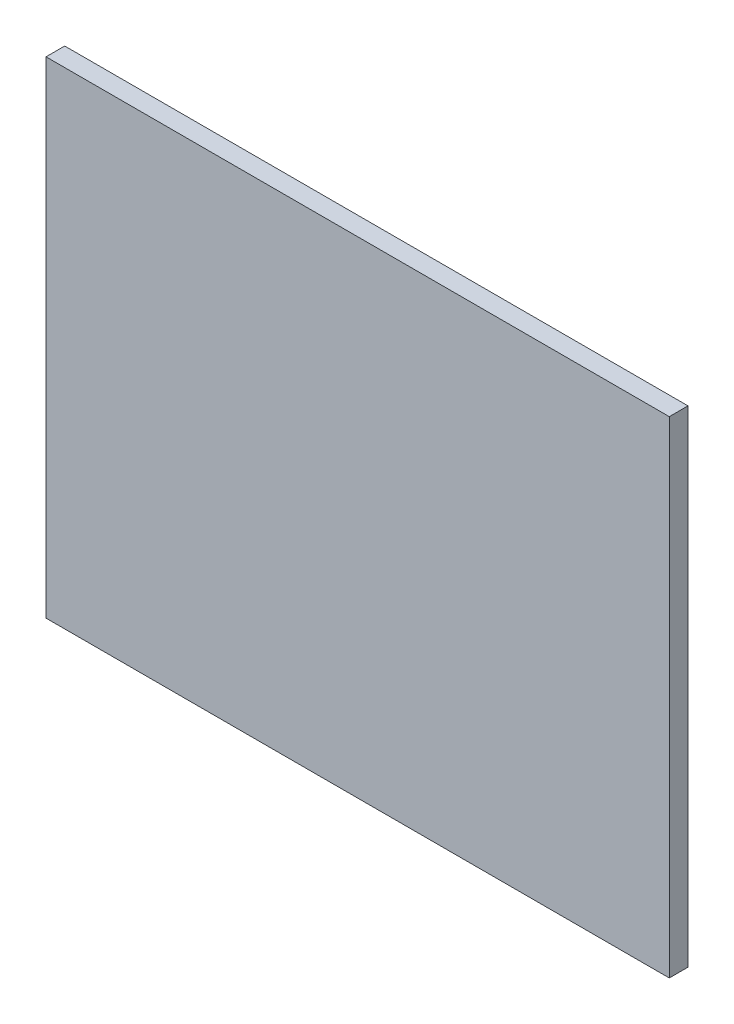
ISO-10303-21;
HEADER;
FILE_DESCRIPTION(('STEP AP214'),'2;1');
FILE_NAME('part.step','',(''),(''),'','','');
FILE_SCHEMA(('AUTOMOTIVE_DESIGN { 1 0 10303 214 1 1 1 1 }'));
ENDSEC;
DATA;
#1=APPLICATION_CONTEXT('core data for automotive mechanical design processes');
#2=APPLICATION_PROTOCOL_DEFINITION('international standard','automotive_design',2000,#1);
#3=PRODUCT_CONTEXT('',#1,'mechanical');
#4=PRODUCT('Part','Part','',(#3));
#5=PRODUCT_RELATED_PRODUCT_CATEGORY('part','',(#4));
#6=PRODUCT_DEFINITION_FORMATION('','',#4);
#7=PRODUCT_DEFINITION_CONTEXT('part definition',#1,'design');
#8=PRODUCT_DEFINITION('design','',#6,#7);
#9=PRODUCT_DEFINITION_SHAPE('','',#8);
#10=(LENGTH_UNIT() NAMED_UNIT(*) SI_UNIT(.MILLI.,.METRE.));
#11=(NAMED_UNIT(*) PLANE_ANGLE_UNIT() SI_UNIT($,.RADIAN.));
#12=(NAMED_UNIT(*) SI_UNIT($,.STERADIAN.) SOLID_ANGLE_UNIT());
#13=UNCERTAINTY_MEASURE_WITH_UNIT(LENGTH_MEASURE(1.E-05),#10,'distance_accuracy_value','');
#14=(GEOMETRIC_REPRESENTATION_CONTEXT(3) GLOBAL_UNCERTAINTY_ASSIGNED_CONTEXT((#13)) GLOBAL_UNIT_ASSIGNED_CONTEXT((#10,
#11,#12)) REPRESENTATION_CONTEXT('',''));
#15=CARTESIAN_POINT('',(0.,0.,0.));
#16=DIRECTION('',(0.,0.,1.));
#17=DIRECTION('',(1.,0.,0.));
#18=AXIS2_PLACEMENT_3D('',#15,#16,#17);
#19=CARTESIAN_POINT('',(250.,195.,15.));
#20=DIRECTION('',(-1.,0.,0.));
#21=DIRECTION('',(0.,-1.,0.));
#22=AXIS2_PLACEMENT_3D('',#19,#20,#21);
#23=PLANE('',#22);
#24=DIRECTION('',(0.,1.,0.));
#25=VECTOR('',#24,1.);
#26=CARTESIAN_POINT('',(250.,195.,0.));
#27=LINE('',#26,#25);
#28=CARTESIAN_POINT('',(250.,-195.,0.));
#29=VERTEX_POINT('',#28);
#30=CARTESIAN_POINT('',(250.,195.,0.));
#31=VERTEX_POINT('',#30);
#32=EDGE_CURVE('E107',#29,#31,#27,.T.);
#33=ORIENTED_EDGE('',*,*,#32,.T.);
#34=DIRECTION('',(0.,0.,-1.));
#35=VECTOR('',#34,1.);
#36=CARTESIAN_POINT('',(250.,195.,15.));
#37=LINE('',#36,#35);
#38=CARTESIAN_POINT('',(250.,195.,15.));
#39=VERTEX_POINT('',#38);
#40=EDGE_CURVE('E11',#39,#31,#37,.T.);
#41=ORIENTED_EDGE('',*,*,#40,.F.);
#42=DIRECTION('',(0.,1.,0.));
#43=VECTOR('',#42,1.);
#44=CARTESIAN_POINT('',(250.,195.,15.));
#45=LINE('',#44,#43);
#46=CARTESIAN_POINT('',(250.,-195.,15.));
#47=VERTEX_POINT('',#46);
#48=EDGE_CURVE('E91',#47,#39,#45,.T.);
#49=ORIENTED_EDGE('',*,*,#48,.F.);
#50=DIRECTION('',(0.,0.,-1.));
#51=VECTOR('',#50,1.);
#52=CARTESIAN_POINT('',(250.,-195.,15.));
#53=LINE('',#52,#51);
#54=EDGE_CURVE('E103',#47,#29,#53,.T.);
#55=ORIENTED_EDGE('',*,*,#54,.T.);
#56=EDGE_LOOP('',(#33,#41,#49,#55));
#57=FACE_BOUND('',#56,.T.);
#58=ADVANCED_FACE('F39',(#57),#23,.F.);
#59=CARTESIAN_POINT('',(-250.,195.,15.));
#60=DIRECTION('',(0.,-1.,0.));
#61=DIRECTION('',(0.,0.,-1.));
#62=AXIS2_PLACEMENT_3D('',#59,#60,#61);
#63=PLANE('',#62);
#64=DIRECTION('',(-1.,0.,0.));
#65=VECTOR('',#64,1.);
#66=CARTESIAN_POINT('',(-250.,195.,0.));
#67=LINE('',#66,#65);
#68=CARTESIAN_POINT('',(-250.,195.,0.));
#69=VERTEX_POINT('',#68);
#70=EDGE_CURVE('E96',#31,#69,#67,.T.);
#71=ORIENTED_EDGE('',*,*,#70,.T.);
#72=DIRECTION('',(0.,0.,-1.));
#73=VECTOR('',#72,1.);
#74=CARTESIAN_POINT('',(-250.,195.,15.));
#75=LINE('',#74,#73);
#76=CARTESIAN_POINT('',(-250.,195.,15.));
#77=VERTEX_POINT('',#76);
#78=EDGE_CURVE('E48',#77,#69,#75,.T.);
#79=ORIENTED_EDGE('',*,*,#78,.F.);
#80=DIRECTION('',(-1.,0.,0.));
#81=VECTOR('',#80,1.);
#82=CARTESIAN_POINT('',(-250.,195.,15.));
#83=LINE('',#82,#81);
#84=EDGE_CURVE('E86',#39,#77,#83,.T.);
#85=ORIENTED_EDGE('',*,*,#84,.F.);
#86=ORIENTED_EDGE('',*,*,#40,.T.);
#87=EDGE_LOOP('',(#71,#79,#85,#86));
#88=FACE_BOUND('',#87,.T.);
#89=ADVANCED_FACE('F95',(#88),#63,.F.);
#90=CARTESIAN_POINT('',(-250.,195.,15.));
#91=DIRECTION('',(1.,0.,0.));
#92=DIRECTION('',(0.,1.,0.));
#93=AXIS2_PLACEMENT_3D('',#90,#91,#92);
#94=PLANE('',#93);
#95=DIRECTION('',(0.,-1.,0.));
#96=VECTOR('',#95,1.);
#97=CARTESIAN_POINT('',(-250.,195.,0.));
#98=LINE('',#97,#96);
#99=CARTESIAN_POINT('',(-250.,-195.,0.));
#100=VERTEX_POINT('',#99);
#101=EDGE_CURVE('E73',#69,#100,#98,.T.);
#102=ORIENTED_EDGE('',*,*,#101,.T.);
#103=DIRECTION('',(0.,0.,-1.));
#104=VECTOR('',#103,1.);
#105=CARTESIAN_POINT('',(-250.,-195.,15.));
#106=LINE('',#105,#104);
#107=CARTESIAN_POINT('',(-250.,-195.,15.));
#108=VERTEX_POINT('',#107);
#109=EDGE_CURVE('E98',#108,#100,#106,.T.);
#110=ORIENTED_EDGE('',*,*,#109,.F.);
#111=DIRECTION('',(0.,-1.,0.));
#112=VECTOR('',#111,1.);
#113=CARTESIAN_POINT('',(-250.,195.,15.));
#114=LINE('',#113,#112);
#115=EDGE_CURVE('E89',#77,#108,#114,.T.);
#116=ORIENTED_EDGE('',*,*,#115,.F.);
#117=ORIENTED_EDGE('',*,*,#78,.T.);
#118=EDGE_LOOP('',(#102,#110,#116,#117));
#119=FACE_BOUND('',#118,.T.);
#120=ADVANCED_FACE('F99',(#119),#94,.F.);
#121=CARTESIAN_POINT('',(-250.,-195.,15.));
#122=DIRECTION('',(0.,1.,0.));
#123=DIRECTION('',(0.,0.,1.));
#124=AXIS2_PLACEMENT_3D('',#121,#122,#123);
#125=PLANE('',#124);
#126=DIRECTION('',(1.,0.,0.));
#127=VECTOR('',#126,1.);
#128=CARTESIAN_POINT('',(-250.,-195.,0.));
#129=LINE('',#128,#127);
#130=EDGE_CURVE('E79',#100,#29,#129,.T.);
#131=ORIENTED_EDGE('',*,*,#130,.T.);
#132=ORIENTED_EDGE('',*,*,#54,.F.);
#133=DIRECTION('',(1.,0.,0.));
#134=VECTOR('',#133,1.);
#135=CARTESIAN_POINT('',(-250.,-195.,15.));
#136=LINE('',#135,#134);
#137=EDGE_CURVE('E56',#108,#47,#136,.T.);
#138=ORIENTED_EDGE('',*,*,#137,.F.);
#139=ORIENTED_EDGE('',*,*,#109,.T.);
#140=EDGE_LOOP('',(#131,#132,#138,#139));
#141=FACE_BOUND('',#140,.T.);
#142=ADVANCED_FACE('F120',(#141),#125,.F.);
#143=CARTESIAN_POINT('',(0.,0.,15.));
#144=DIRECTION('',(0.,0.,1.));
#145=DIRECTION('',(1.,0.,0.));
#146=AXIS2_PLACEMENT_3D('',#143,#144,#145);
#147=PLANE('',#146);
#148=ORIENTED_EDGE('',*,*,#48,.T.);
#149=ORIENTED_EDGE('',*,*,#84,.T.);
#150=ORIENTED_EDGE('',*,*,#115,.T.);
#151=ORIENTED_EDGE('',*,*,#137,.T.);
#152=EDGE_LOOP('',(#148,#149,#150,#151));
#153=FACE_BOUND('',#152,.T.);
#154=ADVANCED_FACE('F87',(#153),#147,.T.);
#155=CARTESIAN_POINT('',(0.,0.,0.));
#156=DIRECTION('',(0.,0.,1.));
#157=DIRECTION('',(1.,0.,0.));
#158=AXIS2_PLACEMENT_3D('',#155,#156,#157);
#159=PLANE('',#158);
#160=ORIENTED_EDGE('',*,*,#32,.F.);
#161=ORIENTED_EDGE('',*,*,#130,.F.);
#162=ORIENTED_EDGE('',*,*,#101,.F.);
#163=ORIENTED_EDGE('',*,*,#70,.F.);
#164=EDGE_LOOP('',(#160,#161,#162,#163));
#165=FACE_BOUND('',#164,.T.);
#166=ADVANCED_FACE('F123',(#165),#159,.F.);
#167=CLOSED_SHELL('',(#58,#89,#120,#142,#154,#166));
#168=MANIFOLD_SOLID_BREP('B2',#167);
#169=ADVANCED_BREP_SHAPE_REPRESENTATION('',(#18,#168),#14);
#170=SHAPE_DEFINITION_REPRESENTATION(#9,#169);
ENDSEC;
END-ISO-10303-21;
